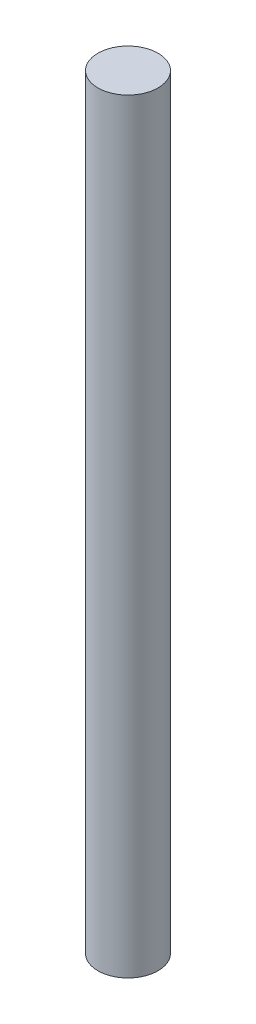
ISO-10303-21;
HEADER;
FILE_DESCRIPTION(('STEP AP214'),'2;1');
FILE_NAME('part.step','',(''),(''),'','','');
FILE_SCHEMA(('AUTOMOTIVE_DESIGN { 1 0 10303 214 1 1 1 1 }'));
ENDSEC;
DATA;
#1=APPLICATION_CONTEXT('core data for automotive mechanical design processes');
#2=APPLICATION_PROTOCOL_DEFINITION('international standard','automotive_design',2000,#1);
#3=PRODUCT_CONTEXT('',#1,'mechanical');
#4=PRODUCT('Part','Part','',(#3));
#5=PRODUCT_RELATED_PRODUCT_CATEGORY('part','',(#4));
#6=PRODUCT_DEFINITION_FORMATION('','',#4);
#7=PRODUCT_DEFINITION_CONTEXT('part definition',#1,'design');
#8=PRODUCT_DEFINITION('design','',#6,#7);
#9=PRODUCT_DEFINITION_SHAPE('','',#8);
#10=(LENGTH_UNIT() NAMED_UNIT(*) SI_UNIT(.MILLI.,.METRE.));
#11=(NAMED_UNIT(*) PLANE_ANGLE_UNIT() SI_UNIT($,.RADIAN.));
#12=(NAMED_UNIT(*) SI_UNIT($,.STERADIAN.) SOLID_ANGLE_UNIT());
#13=UNCERTAINTY_MEASURE_WITH_UNIT(LENGTH_MEASURE(1.E-05),#10,'distance_accuracy_value','');
#14=(GEOMETRIC_REPRESENTATION_CONTEXT(3) GLOBAL_UNCERTAINTY_ASSIGNED_CONTEXT((#13)) GLOBAL_UNIT_ASSIGNED_CONTEXT((#10,
#11,#12)) REPRESENTATION_CONTEXT('',''));
#15=CARTESIAN_POINT('',(0.,0.,0.));
#16=DIRECTION('',(0.,0.,1.));
#17=DIRECTION('',(1.,0.,0.));
#18=AXIS2_PLACEMENT_3D('',#15,#16,#17);
#19=CARTESIAN_POINT('',(0.,101.6,0.));
#20=DIRECTION('',(0.,-1.,0.));
#21=DIRECTION('',(0.,0.,-1.));
#22=AXIS2_PLACEMENT_3D('',#19,#20,#21);
#23=CYLINDRICAL_SURFACE('',#22,3.995);
#24=CARTESIAN_POINT('',(0.,101.6,0.));
#25=DIRECTION('',(0.,1.,0.));
#26=DIRECTION('',(0.,0.,1.));
#27=AXIS2_PLACEMENT_3D('',#24,#25,#26);
#28=CIRCLE('',#27,3.995);
#29=CARTESIAN_POINT('',(0.,101.6,3.995));
#30=VERTEX_POINT('',#29);
#31=EDGE_CURVE('E10',#30,#30,#28,.T.);
#32=ORIENTED_EDGE('',*,*,#31,.F.);
#33=EDGE_LOOP('',(#32));
#34=FACE_BOUND('',#33,.T.);
#35=CARTESIAN_POINT('',(0.,0.,0.));
#36=DIRECTION('',(0.,1.,0.));
#37=DIRECTION('',(0.,0.,1.));
#38=AXIS2_PLACEMENT_3D('',#35,#36,#37);
#39=CIRCLE('',#38,3.995);
#40=CARTESIAN_POINT('',(0.,0.,3.995));
#41=VERTEX_POINT('',#40);
#42=EDGE_CURVE('E46',#41,#41,#39,.T.);
#43=ORIENTED_EDGE('',*,*,#42,.T.);
#44=EDGE_LOOP('',(#43));
#45=FACE_BOUND('',#44,.T.);
#46=ADVANCED_FACE('F43',(#34,#45),#23,.T.);
#47=CARTESIAN_POINT('',(0.,101.6,0.));
#48=DIRECTION('',(0.,1.,0.));
#49=DIRECTION('',(0.,0.,1.));
#50=AXIS2_PLACEMENT_3D('',#47,#48,#49);
#51=PLANE('',#50);
#52=ORIENTED_EDGE('',*,*,#31,.T.);
#53=EDGE_LOOP('',(#52));
#54=FACE_BOUND('',#53,.T.);
#55=ADVANCED_FACE('F60',(#54),#51,.T.);
#56=CARTESIAN_POINT('',(0.,0.,0.));
#57=DIRECTION('',(0.,1.,0.));
#58=DIRECTION('',(0.,0.,1.));
#59=AXIS2_PLACEMENT_3D('',#56,#57,#58);
#60=PLANE('',#59);
#61=ORIENTED_EDGE('',*,*,#42,.F.);
#62=EDGE_LOOP('',(#61));
#63=FACE_BOUND('',#62,.T.);
#64=ADVANCED_FACE('F58',(#63),#60,.F.);
#65=CLOSED_SHELL('',(#46,#55,#64));
#66=MANIFOLD_SOLID_BREP('B2',#65);
#67=ADVANCED_BREP_SHAPE_REPRESENTATION('',(#18,#66),#14);
#68=SHAPE_DEFINITION_REPRESENTATION(#9,#67);
ENDSEC;
END-ISO-10303-21;
